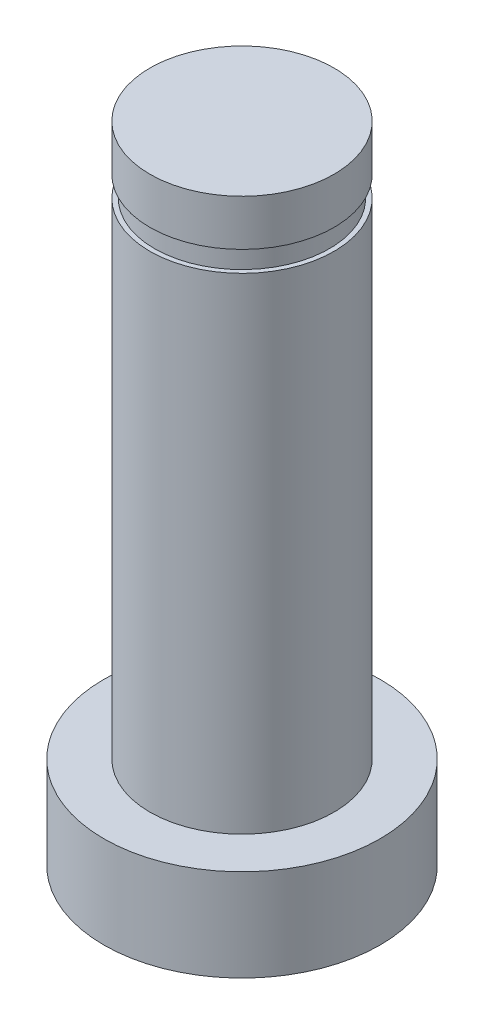
ISO-10303-21;
HEADER;
FILE_DESCRIPTION(('STEP AP214'),'2;1');
FILE_NAME('part.step','',(''),(''),'','','');
FILE_SCHEMA(('AUTOMOTIVE_DESIGN { 1 0 10303 214 1 1 1 1 }'));
ENDSEC;
DATA;
#1=APPLICATION_CONTEXT('core data for automotive mechanical design processes');
#2=APPLICATION_PROTOCOL_DEFINITION('international standard','automotive_design',2000,#1);
#3=PRODUCT_CONTEXT('',#1,'mechanical');
#4=PRODUCT('Part','Part','',(#3));
#5=PRODUCT_RELATED_PRODUCT_CATEGORY('part','',(#4));
#6=PRODUCT_DEFINITION_FORMATION('','',#4);
#7=PRODUCT_DEFINITION_CONTEXT('part definition',#1,'design');
#8=PRODUCT_DEFINITION('design','',#6,#7);
#9=PRODUCT_DEFINITION_SHAPE('','',#8);
#10=(LENGTH_UNIT() NAMED_UNIT(*) SI_UNIT(.MILLI.,.METRE.));
#11=(NAMED_UNIT(*) PLANE_ANGLE_UNIT() SI_UNIT($,.RADIAN.));
#12=(NAMED_UNIT(*) SI_UNIT($,.STERADIAN.) SOLID_ANGLE_UNIT());
#13=UNCERTAINTY_MEASURE_WITH_UNIT(LENGTH_MEASURE(1.E-05),#10,'distance_accuracy_value','');
#14=(GEOMETRIC_REPRESENTATION_CONTEXT(3) GLOBAL_UNCERTAINTY_ASSIGNED_CONTEXT((#13)) GLOBAL_UNIT_ASSIGNED_CONTEXT((#10,
#11,#12)) REPRESENTATION_CONTEXT('',''));
#15=CARTESIAN_POINT('',(0.,0.,0.));
#16=DIRECTION('',(0.,0.,1.));
#17=DIRECTION('',(1.,0.,0.));
#18=AXIS2_PLACEMENT_3D('',#15,#16,#17);
#19=CARTESIAN_POINT('',(0.,4.,0.));
#20=DIRECTION('',(0.,-1.,0.));
#21=DIRECTION('',(0.,0.,-1.));
#22=AXIS2_PLACEMENT_3D('',#19,#20,#21);
#23=CYLINDRICAL_SURFACE('',#22,6.);
#24=CARTESIAN_POINT('',(0.,4.,0.));
#25=DIRECTION('',(0.,1.,0.));
#26=DIRECTION('',(0.,0.,1.));
#27=AXIS2_PLACEMENT_3D('',#24,#25,#26);
#28=CIRCLE('',#27,6.);
#29=CARTESIAN_POINT('',(0.,4.,6.));
#30=VERTEX_POINT('',#29);
#31=EDGE_CURVE('E46',#30,#30,#28,.T.);
#32=ORIENTED_EDGE('',*,*,#31,.F.);
#33=EDGE_LOOP('',(#32));
#34=FACE_BOUND('',#33,.T.);
#35=CARTESIAN_POINT('',(0.,0.,0.));
#36=DIRECTION('',(0.,1.,0.));
#37=DIRECTION('',(0.,0.,1.));
#38=AXIS2_PLACEMENT_3D('',#35,#36,#37);
#39=CIRCLE('',#38,6.);
#40=CARTESIAN_POINT('',(0.,0.,6.));
#41=VERTEX_POINT('',#40);
#42=EDGE_CURVE('E37',#41,#41,#39,.T.);
#43=ORIENTED_EDGE('',*,*,#42,.T.);
#44=EDGE_LOOP('',(#43));
#45=FACE_BOUND('',#44,.T.);
#46=ADVANCED_FACE('F34',(#34,#45),#23,.T.);
#47=CARTESIAN_POINT('',(0.,4.,0.));
#48=DIRECTION('',(0.,1.,0.));
#49=DIRECTION('',(0.,0.,1.));
#50=AXIS2_PLACEMENT_3D('',#47,#48,#49);
#51=PLANE('',#50);
#52=CARTESIAN_POINT('',(0.,4.,0.));
#53=DIRECTION('',(0.,1.,0.));
#54=DIRECTION('',(0.,0.,1.));
#55=AXIS2_PLACEMENT_3D('',#52,#53,#54);
#56=CIRCLE('',#55,4.);
#57=CARTESIAN_POINT('',(0.,4.,4.));
#58=VERTEX_POINT('',#57);
#59=EDGE_CURVE('E41',#58,#58,#56,.T.);
#60=ORIENTED_EDGE('',*,*,#59,.F.);
#61=EDGE_LOOP('',(#60));
#62=FACE_BOUND('',#61,.T.);
#63=ORIENTED_EDGE('',*,*,#31,.T.);
#64=EDGE_LOOP('',(#63));
#65=FACE_BOUND('',#64,.T.);
#66=ADVANCED_FACE('F64',(#62,#65),#51,.T.);
#67=CARTESIAN_POINT('',(0.,0.,0.));
#68=DIRECTION('',(0.,1.,0.));
#69=DIRECTION('',(0.,0.,1.));
#70=AXIS2_PLACEMENT_3D('',#67,#68,#69);
#71=PLANE('',#70);
#72=ORIENTED_EDGE('',*,*,#42,.F.);
#73=EDGE_LOOP('',(#72));
#74=FACE_BOUND('',#73,.T.);
#75=ADVANCED_FACE('F61',(#74),#71,.F.);
#76=CARTESIAN_POINT('',(0.,25.1,0.));
#77=DIRECTION('',(0.,-1.,0.));
#78=DIRECTION('',(0.,0.,-1.));
#79=AXIS2_PLACEMENT_3D('',#76,#77,#78);
#80=CYLINDRICAL_SURFACE('',#79,4.);
#81=CARTESIAN_POINT('',(0.,25.1,0.));
#82=DIRECTION('',(0.,1.,0.));
#83=DIRECTION('',(0.,0.,1.));
#84=AXIS2_PLACEMENT_3D('',#81,#82,#83);
#85=CIRCLE('',#84,4.);
#86=CARTESIAN_POINT('',(0.,25.1,4.));
#87=VERTEX_POINT('',#86);
#88=EDGE_CURVE('E52',#87,#87,#85,.T.);
#89=ORIENTED_EDGE('',*,*,#88,.F.);
#90=EDGE_LOOP('',(#89));
#91=FACE_BOUND('',#90,.T.);
#92=ORIENTED_EDGE('',*,*,#59,.T.);
#93=EDGE_LOOP('',(#92));
#94=FACE_BOUND('',#93,.T.);
#95=ADVANCED_FACE('F63',(#91,#94),#80,.T.);
#96=CARTESIAN_POINT('',(0.,25.1,0.));
#97=DIRECTION('',(0.,1.,0.));
#98=DIRECTION('',(0.,0.,1.));
#99=AXIS2_PLACEMENT_3D('',#96,#97,#98);
#100=PLANE('',#99);
#101=CARTESIAN_POINT('',(0.,25.1,0.));
#102=DIRECTION('',(0.,1.,0.));
#103=DIRECTION('',(0.,0.,1.));
#104=AXIS2_PLACEMENT_3D('',#101,#102,#103);
#105=CIRCLE('',#104,3.8);
#106=CARTESIAN_POINT('',(0.,25.1,3.8));
#107=VERTEX_POINT('',#106);
#108=EDGE_CURVE('E10',#107,#107,#105,.T.);
#109=ORIENTED_EDGE('',*,*,#108,.F.);
#110=EDGE_LOOP('',(#109));
#111=FACE_BOUND('',#110,.T.);
#112=ORIENTED_EDGE('',*,*,#88,.T.);
#113=EDGE_LOOP('',(#112));
#114=FACE_BOUND('',#113,.T.);
#115=ADVANCED_FACE('F69',(#111,#114),#100,.T.);
#116=CARTESIAN_POINT('',(0.,26.,0.));
#117=DIRECTION('',(0.,-1.,0.));
#118=DIRECTION('',(0.,0.,-1.));
#119=AXIS2_PLACEMENT_3D('',#116,#117,#118);
#120=CYLINDRICAL_SURFACE('',#119,3.8);
#121=CARTESIAN_POINT('',(0.,26.,0.));
#122=DIRECTION('',(0.,1.,0.));
#123=DIRECTION('',(0.,0.,1.));
#124=AXIS2_PLACEMENT_3D('',#121,#122,#123);
#125=CIRCLE('',#124,3.8);
#126=CARTESIAN_POINT('',(0.,26.,3.8));
#127=VERTEX_POINT('',#126);
#128=EDGE_CURVE('E50',#127,#127,#125,.T.);
#129=ORIENTED_EDGE('',*,*,#128,.F.);
#130=EDGE_LOOP('',(#129));
#131=FACE_BOUND('',#130,.T.);
#132=ORIENTED_EDGE('',*,*,#108,.T.);
#133=EDGE_LOOP('',(#132));
#134=FACE_BOUND('',#133,.T.);
#135=ADVANCED_FACE('F99',(#131,#134),#120,.T.);
#136=CARTESIAN_POINT('',(0.,28.,0.));
#137=DIRECTION('',(0.,-1.,0.));
#138=DIRECTION('',(0.,0.,-1.));
#139=AXIS2_PLACEMENT_3D('',#136,#137,#138);
#140=CYLINDRICAL_SURFACE('',#139,4.);
#141=CARTESIAN_POINT('',(0.,28.,0.));
#142=DIRECTION('',(0.,1.,0.));
#143=DIRECTION('',(0.,0.,1.));
#144=AXIS2_PLACEMENT_3D('',#141,#142,#143);
#145=CIRCLE('',#144,4.);
#146=CARTESIAN_POINT('',(0.,28.,4.));
#147=VERTEX_POINT('',#146);
#148=EDGE_CURVE('E150',#147,#147,#145,.T.);
#149=ORIENTED_EDGE('',*,*,#148,.F.);
#150=EDGE_LOOP('',(#149));
#151=FACE_BOUND('',#150,.T.);
#152=CARTESIAN_POINT('',(0.,26.,0.));
#153=DIRECTION('',(0.,1.,0.));
#154=DIRECTION('',(0.,0.,1.));
#155=AXIS2_PLACEMENT_3D('',#152,#153,#154);
#156=CIRCLE('',#155,4.);
#157=CARTESIAN_POINT('',(0.,26.,4.));
#158=VERTEX_POINT('',#157);
#159=EDGE_CURVE('E148',#158,#158,#156,.T.);
#160=ORIENTED_EDGE('',*,*,#159,.T.);
#161=EDGE_LOOP('',(#160));
#162=FACE_BOUND('',#161,.T.);
#163=ADVANCED_FACE('F109',(#151,#162),#140,.T.);
#164=CARTESIAN_POINT('',(0.,28.,0.));
#165=DIRECTION('',(0.,1.,0.));
#166=DIRECTION('',(0.,0.,1.));
#167=AXIS2_PLACEMENT_3D('',#164,#165,#166);
#168=PLANE('',#167);
#169=ORIENTED_EDGE('',*,*,#148,.T.);
#170=EDGE_LOOP('',(#169));
#171=FACE_BOUND('',#170,.T.);
#172=ADVANCED_FACE('F119',(#171),#168,.T.);
#173=CARTESIAN_POINT('',(0.,26.,0.));
#174=DIRECTION('',(0.,1.,0.));
#175=DIRECTION('',(0.,0.,1.));
#176=AXIS2_PLACEMENT_3D('',#173,#174,#175);
#177=PLANE('',#176);
#178=ORIENTED_EDGE('',*,*,#128,.T.);
#179=EDGE_LOOP('',(#178));
#180=FACE_BOUND('',#179,.T.);
#181=ORIENTED_EDGE('',*,*,#159,.F.);
#182=EDGE_LOOP('',(#181));
#183=FACE_BOUND('',#182,.T.);
#184=ADVANCED_FACE('F129',(#180,#183),#177,.F.);
#185=CLOSED_SHELL('',(#46,#66,#75,#95,#115,#135,#163,#172,#184));
#186=MANIFOLD_SOLID_BREP('B2',#185);
#187=ADVANCED_BREP_SHAPE_REPRESENTATION('',(#18,#186),#14);
#188=SHAPE_DEFINITION_REPRESENTATION(#9,#187);
ENDSEC;
END-ISO-10303-21;
